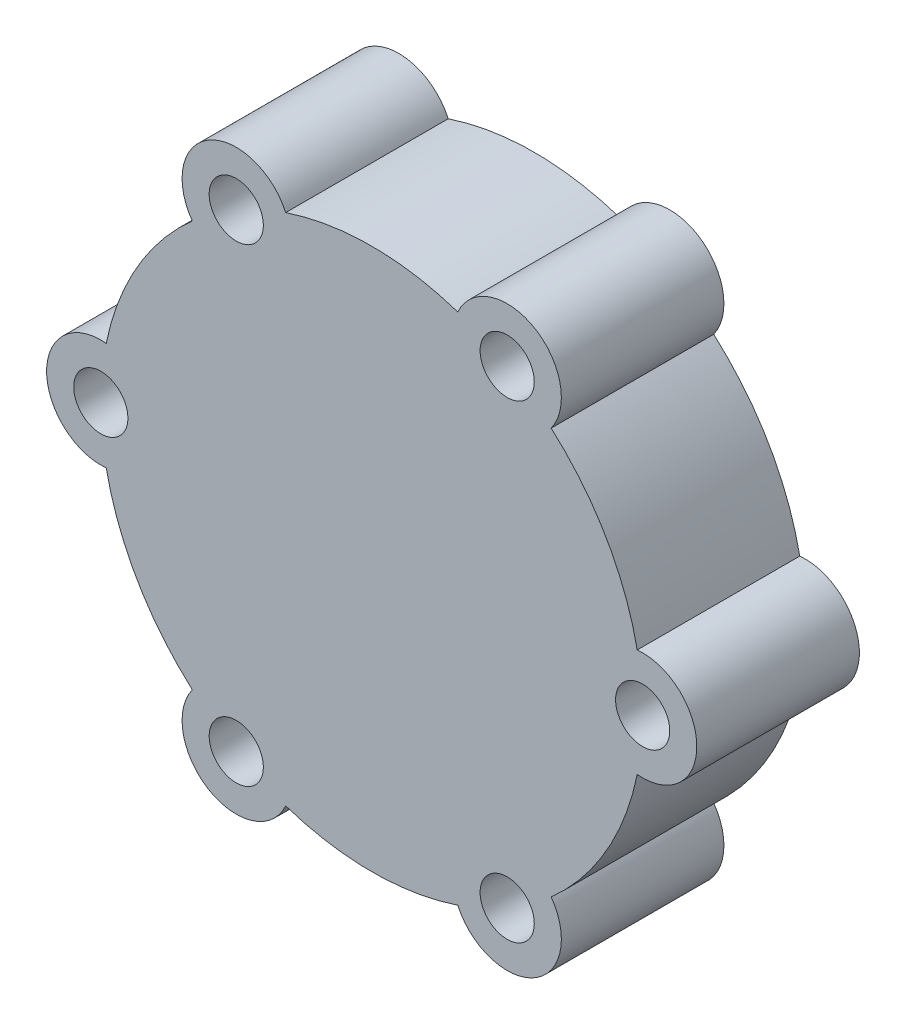
ISO-10303-21;
HEADER;
FILE_DESCRIPTION(('STEP AP214'),'2;1');
FILE_NAME('part.step','',(''),(''),'','','');
FILE_SCHEMA(('AUTOMOTIVE_DESIGN { 1 0 10303 214 1 1 1 1 }'));
ENDSEC;
DATA;
#1=APPLICATION_CONTEXT('core data for automotive mechanical design processes');
#2=APPLICATION_PROTOCOL_DEFINITION('international standard','automotive_design',2000,#1);
#3=PRODUCT_CONTEXT('',#1,'mechanical');
#4=PRODUCT('Part','Part','',(#3));
#5=PRODUCT_RELATED_PRODUCT_CATEGORY('part','',(#4));
#6=PRODUCT_DEFINITION_FORMATION('','',#4);
#7=PRODUCT_DEFINITION_CONTEXT('part definition',#1,'design');
#8=PRODUCT_DEFINITION('design','',#6,#7);
#9=PRODUCT_DEFINITION_SHAPE('','',#8);
#10=(LENGTH_UNIT() NAMED_UNIT(*) SI_UNIT(.MILLI.,.METRE.));
#11=(NAMED_UNIT(*) PLANE_ANGLE_UNIT() SI_UNIT($,.RADIAN.));
#12=(NAMED_UNIT(*) SI_UNIT($,.STERADIAN.) SOLID_ANGLE_UNIT());
#13=UNCERTAINTY_MEASURE_WITH_UNIT(LENGTH_MEASURE(1.E-05),#10,'distance_accuracy_value','');
#14=(GEOMETRIC_REPRESENTATION_CONTEXT(3) GLOBAL_UNCERTAINTY_ASSIGNED_CONTEXT((#13)) GLOBAL_UNIT_ASSIGNED_CONTEXT((#10,
#11,#12)) REPRESENTATION_CONTEXT('',''));
#15=CARTESIAN_POINT('',(0.,0.,0.));
#16=DIRECTION('',(0.,0.,1.));
#17=DIRECTION('',(1.,0.,0.));
#18=AXIS2_PLACEMENT_3D('',#15,#16,#17);
#19=CARTESIAN_POINT('',(25.,0.,30.));
#20=DIRECTION('',(0.,0.,1.));
#21=DIRECTION('',(1.,0.,0.));
#22=AXIS2_PLACEMENT_3D('',#19,#20,#21);
#23=PLANE('',#22);
#24=CARTESIAN_POINT('',(-24.9999999999996,43.3012701892222,30.));
#25=DIRECTION('',(0.,0.,1.));
#26=DIRECTION('',(1.,0.,0.));
#27=AXIS2_PLACEMENT_3D('',#24,#25,#26);
#28=CIRCLE('',#27,4.99999999999999);
#29=CARTESIAN_POINT('',(-19.9999999999996,43.3012701892222,30.));
#30=VERTEX_POINT('',#29);
#31=EDGE_CURVE('E303',#30,#30,#28,.T.);
#32=ORIENTED_EDGE('',*,*,#31,.F.);
#33=EDGE_LOOP('',(#32));
#34=FACE_BOUND('',#33,.T.);
#35=CARTESIAN_POINT('',(-25.0000000000002,-43.3012701892218,30.));
#36=DIRECTION('',(0.,0.,1.));
#37=DIRECTION('',(1.,0.,0.));
#38=AXIS2_PLACEMENT_3D('',#35,#36,#37);
#39=CIRCLE('',#38,5.);
#40=CARTESIAN_POINT('',(-20.0000000000002,-43.3012701892218,30.));
#41=VERTEX_POINT('',#40);
#42=EDGE_CURVE('E315',#41,#41,#39,.T.);
#43=ORIENTED_EDGE('',*,*,#42,.F.);
#44=EDGE_LOOP('',(#43));
#45=FACE_BOUND('',#44,.T.);
#46=CARTESIAN_POINT('',(50.,0.,30.));
#47=DIRECTION('',(0.,0.,1.));
#48=DIRECTION('',(1.,0.,0.));
#49=AXIS2_PLACEMENT_3D('',#46,#47,#48);
#50=CIRCLE('',#49,5.);
#51=CARTESIAN_POINT('',(55.,0.,30.));
#52=VERTEX_POINT('',#51);
#53=EDGE_CURVE('E162',#52,#52,#50,.T.);
#54=ORIENTED_EDGE('',*,*,#53,.F.);
#55=EDGE_LOOP('',(#54));
#56=FACE_BOUND('',#55,.T.);
#57=CARTESIAN_POINT('',(50.,0.,30.));
#58=DIRECTION('',(0.,0.,1.));
#59=DIRECTION('',(1.,0.,0.));
#60=AXIS2_PLACEMENT_3D('',#57,#58,#59);
#61=CIRCLE('',#60,10.);
#62=CARTESIAN_POINT('',(49.,-9.94987437106621,30.));
#63=VERTEX_POINT('',#62);
#64=CARTESIAN_POINT('',(49.,9.94987437106621,30.));
#65=VERTEX_POINT('',#64);
#66=EDGE_CURVE('E181',#63,#65,#61,.T.);
#67=ORIENTED_EDGE('',*,*,#66,.T.);
#68=CARTESIAN_POINT('',(0.,0.,30.));
#69=DIRECTION('',(0.,0.,1.));
#70=DIRECTION('',(1.,0.,0.));
#71=AXIS2_PLACEMENT_3D('',#68,#69,#70);
#72=CIRCLE('',#71,50.);
#73=CARTESIAN_POINT('',(33.1168439698075,37.460307599904,30.));
#74=VERTEX_POINT('',#73);
#75=EDGE_CURVE('E109',#65,#74,#72,.T.);
#76=ORIENTED_EDGE('',*,*,#75,.T.);
#77=CARTESIAN_POINT('',(25.0000000000005,43.3012701892216,30.));
#78=DIRECTION('',(0.,0.,1.));
#79=DIRECTION('',(1.,0.,0.));
#80=AXIS2_PLACEMENT_3D('',#77,#78,#79);
#81=CIRCLE('',#80,10.);
#82=CARTESIAN_POINT('',(15.8831560301935,47.4101819709704,30.));
#83=VERTEX_POINT('',#82);
#84=EDGE_CURVE('E208',#74,#83,#81,.T.);
#85=ORIENTED_EDGE('',*,*,#84,.T.);
#86=CARTESIAN_POINT('',(0.,0.,30.));
#87=DIRECTION('',(0.,0.,1.));
#88=DIRECTION('',(1.,0.,0.));
#89=AXIS2_PLACEMENT_3D('',#86,#87,#88);
#90=CIRCLE('',#89,50.);
#91=CARTESIAN_POINT('',(-15.8831560301925,47.4101819709708,30.));
#92=VERTEX_POINT('',#91);
#93=EDGE_CURVE('E227',#83,#92,#90,.T.);
#94=ORIENTED_EDGE('',*,*,#93,.T.);
#95=CARTESIAN_POINT('',(-24.9999999999996,43.3012701892222,30.));
#96=DIRECTION('',(0.,0.,1.));
#97=DIRECTION('',(1.,0.,0.));
#98=AXIS2_PLACEMENT_3D('',#95,#96,#97);
#99=CIRCLE('',#98,10.);
#100=CARTESIAN_POINT('',(-33.1168439698067,37.4603075999047,30.));
#101=VERTEX_POINT('',#100);
#102=EDGE_CURVE('E224',#92,#101,#99,.T.);
#103=ORIENTED_EDGE('',*,*,#102,.T.);
#104=CARTESIAN_POINT('',(0.,0.,30.));
#105=DIRECTION('',(0.,0.,1.));
#106=DIRECTION('',(1.,0.,0.));
#107=AXIS2_PLACEMENT_3D('',#104,#105,#106);
#108=CIRCLE('',#107,50.);
#109=CARTESIAN_POINT('',(-48.9999999999999,9.94987437106655,30.));
#110=VERTEX_POINT('',#109);
#111=EDGE_CURVE('E226',#101,#110,#108,.T.);
#112=ORIENTED_EDGE('',*,*,#111,.T.);
#113=CARTESIAN_POINT('',(-50.,3.49148133884313E-13,30.));
#114=DIRECTION('',(0.,0.,1.));
#115=DIRECTION('',(1.,0.,0.));
#116=AXIS2_PLACEMENT_3D('',#113,#114,#115);
#117=CIRCLE('',#116,10.);
#118=CARTESIAN_POINT('',(-49.0000000000001,-9.94987437106587,30.));
#119=VERTEX_POINT('',#118);
#120=EDGE_CURVE('E229',#110,#119,#117,.T.);
#121=ORIENTED_EDGE('',*,*,#120,.T.);
#122=CARTESIAN_POINT('',(0.,0.,30.));
#123=DIRECTION('',(0.,0.,1.));
#124=DIRECTION('',(1.,0.,0.));
#125=AXIS2_PLACEMENT_3D('',#122,#123,#124);
#126=CIRCLE('',#125,50.);
#127=CARTESIAN_POINT('',(-33.1168439698072,-37.4603075999042,30.));
#128=VERTEX_POINT('',#127);
#129=EDGE_CURVE('E235',#119,#128,#126,.T.);
#130=ORIENTED_EDGE('',*,*,#129,.T.);
#131=CARTESIAN_POINT('',(-25.0000000000002,-43.3012701892218,30.));
#132=DIRECTION('',(0.,0.,1.));
#133=DIRECTION('',(1.,0.,0.));
#134=AXIS2_PLACEMENT_3D('',#131,#132,#133);
#135=CIRCLE('',#134,10.);
#136=CARTESIAN_POINT('',(-15.8831560301932,-47.4101819709705,30.));
#137=VERTEX_POINT('',#136);
#138=EDGE_CURVE('E140',#128,#137,#135,.T.);
#139=ORIENTED_EDGE('',*,*,#138,.T.);
#140=CARTESIAN_POINT('',(0.,0.,30.));
#141=DIRECTION('',(0.,0.,1.));
#142=DIRECTION('',(1.,0.,0.));
#143=AXIS2_PLACEMENT_3D('',#140,#141,#142);
#144=CIRCLE('',#143,50.);
#145=CARTESIAN_POINT('',(15.8831560301928,-47.4101819709706,30.));
#146=VERTEX_POINT('',#145);
#147=EDGE_CURVE('E134',#137,#146,#144,.T.);
#148=ORIENTED_EDGE('',*,*,#147,.T.);
#149=CARTESIAN_POINT('',(24.9999999999999,-43.301270189222,30.));
#150=DIRECTION('',(0.,0.,1.));
#151=DIRECTION('',(1.,0.,0.));
#152=AXIS2_PLACEMENT_3D('',#149,#150,#151);
#153=CIRCLE('',#152,10.);
#154=CARTESIAN_POINT('',(33.116843969807,-37.4603075999045,30.));
#155=VERTEX_POINT('',#154);
#156=EDGE_CURVE('E138',#146,#155,#153,.T.);
#157=ORIENTED_EDGE('',*,*,#156,.T.);
#158=CARTESIAN_POINT('',(0.,0.,30.));
#159=DIRECTION('',(0.,0.,1.));
#160=DIRECTION('',(1.,0.,0.));
#161=AXIS2_PLACEMENT_3D('',#158,#159,#160);
#162=CIRCLE('',#161,50.);
#163=EDGE_CURVE('E54',#155,#63,#162,.T.);
#164=ORIENTED_EDGE('',*,*,#163,.T.);
#165=EDGE_LOOP('',(#67,#76,#85,#94,#103,#112,#121,#130,#139,#148,#157,#164));
#166=FACE_BOUND('',#165,.T.);
#167=CARTESIAN_POINT('',(24.9999999999999,-43.301270189222,30.));
#168=DIRECTION('',(0.,0.,1.));
#169=DIRECTION('',(1.,0.,0.));
#170=AXIS2_PLACEMENT_3D('',#167,#168,#169);
#171=CIRCLE('',#170,5.);
#172=CARTESIAN_POINT('',(29.9999999999999,-43.301270189222,30.));
#173=VERTEX_POINT('',#172);
#174=EDGE_CURVE('E321',#173,#173,#171,.T.);
#175=ORIENTED_EDGE('',*,*,#174,.F.);
#176=EDGE_LOOP('',(#175));
#177=FACE_BOUND('',#176,.T.);
#178=CARTESIAN_POINT('',(-50.,3.49148133884313E-13,30.));
#179=DIRECTION('',(0.,0.,1.));
#180=DIRECTION('',(1.,0.,0.));
#181=AXIS2_PLACEMENT_3D('',#178,#179,#180);
#182=CIRCLE('',#181,4.99999999999999);
#183=CARTESIAN_POINT('',(-45.,3.49148133884313E-13,30.));
#184=VERTEX_POINT('',#183);
#185=EDGE_CURVE('E309',#184,#184,#182,.T.);
#186=ORIENTED_EDGE('',*,*,#185,.F.);
#187=EDGE_LOOP('',(#186));
#188=FACE_BOUND('',#187,.T.);
#189=CARTESIAN_POINT('',(25.0000000000005,43.3012701892216,30.));
#190=DIRECTION('',(0.,0.,1.));
#191=DIRECTION('',(1.,0.,0.));
#192=AXIS2_PLACEMENT_3D('',#189,#190,#191);
#193=CIRCLE('',#192,5.);
#194=CARTESIAN_POINT('',(30.0000000000005,43.3012701892216,30.));
#195=VERTEX_POINT('',#194);
#196=EDGE_CURVE('E294',#195,#195,#193,.T.);
#197=ORIENTED_EDGE('',*,*,#196,.F.);
#198=EDGE_LOOP('',(#197));
#199=FACE_BOUND('',#198,.T.);
#200=ADVANCED_FACE('F37',(#34,#45,#56,#166,#177,#188,#199),#23,.T.);
#201=CARTESIAN_POINT('',(25.,0.,0.));
#202=DIRECTION('',(0.,0.,1.));
#203=DIRECTION('',(1.,0.,0.));
#204=AXIS2_PLACEMENT_3D('',#201,#202,#203);
#205=PLANE('',#204);
#206=CARTESIAN_POINT('',(50.,0.,0.));
#207=DIRECTION('',(0.,0.,1.));
#208=DIRECTION('',(1.,0.,0.));
#209=AXIS2_PLACEMENT_3D('',#206,#207,#208);
#210=CIRCLE('',#209,10.);
#211=CARTESIAN_POINT('',(49.,-9.94987437106621,0.));
#212=VERTEX_POINT('',#211);
#213=CARTESIAN_POINT('',(49.,9.94987437106621,0.));
#214=VERTEX_POINT('',#213);
#215=EDGE_CURVE('E158',#212,#214,#210,.T.);
#216=ORIENTED_EDGE('',*,*,#215,.F.);
#217=CARTESIAN_POINT('',(0.,0.,0.));
#218=DIRECTION('',(0.,0.,1.));
#219=DIRECTION('',(1.,0.,0.));
#220=AXIS2_PLACEMENT_3D('',#217,#218,#219);
#221=CIRCLE('',#220,50.);
#222=CARTESIAN_POINT('',(33.116843969807,-37.4603075999045,0.));
#223=VERTEX_POINT('',#222);
#224=EDGE_CURVE('E101',#223,#212,#221,.T.);
#225=ORIENTED_EDGE('',*,*,#224,.F.);
#226=CARTESIAN_POINT('',(24.9999999999999,-43.301270189222,0.));
#227=DIRECTION('',(0.,0.,1.));
#228=DIRECTION('',(1.,0.,0.));
#229=AXIS2_PLACEMENT_3D('',#226,#227,#228);
#230=CIRCLE('',#229,10.);
#231=CARTESIAN_POINT('',(15.8831560301928,-47.4101819709706,0.));
#232=VERTEX_POINT('',#231);
#233=EDGE_CURVE('E95',#232,#223,#230,.T.);
#234=ORIENTED_EDGE('',*,*,#233,.F.);
#235=CARTESIAN_POINT('',(0.,0.,0.));
#236=DIRECTION('',(0.,0.,1.));
#237=DIRECTION('',(1.,0.,0.));
#238=AXIS2_PLACEMENT_3D('',#235,#236,#237);
#239=CIRCLE('',#238,50.);
#240=CARTESIAN_POINT('',(-15.8831560301932,-47.4101819709705,0.));
#241=VERTEX_POINT('',#240);
#242=EDGE_CURVE('E148',#241,#232,#239,.T.);
#243=ORIENTED_EDGE('',*,*,#242,.F.);
#244=CARTESIAN_POINT('',(-25.0000000000002,-43.3012701892218,0.));
#245=DIRECTION('',(0.,0.,1.));
#246=DIRECTION('',(1.,0.,0.));
#247=AXIS2_PLACEMENT_3D('',#244,#245,#246);
#248=CIRCLE('',#247,10.);
#249=CARTESIAN_POINT('',(-33.1168439698072,-37.4603075999042,0.));
#250=VERTEX_POINT('',#249);
#251=EDGE_CURVE('E176',#250,#241,#248,.T.);
#252=ORIENTED_EDGE('',*,*,#251,.F.);
#253=CARTESIAN_POINT('',(0.,0.,0.));
#254=DIRECTION('',(0.,0.,1.));
#255=DIRECTION('',(1.,0.,0.));
#256=AXIS2_PLACEMENT_3D('',#253,#254,#255);
#257=CIRCLE('',#256,50.);
#258=CARTESIAN_POINT('',(-49.0000000000001,-9.94987437106587,0.));
#259=VERTEX_POINT('',#258);
#260=EDGE_CURVE('E174',#259,#250,#257,.T.);
#261=ORIENTED_EDGE('',*,*,#260,.F.);
#262=CARTESIAN_POINT('',(-50.,3.49148133884313E-13,0.));
#263=DIRECTION('',(0.,0.,1.));
#264=DIRECTION('',(1.,0.,0.));
#265=AXIS2_PLACEMENT_3D('',#262,#263,#264);
#266=CIRCLE('',#265,10.);
#267=CARTESIAN_POINT('',(-48.9999999999999,9.94987437106655,0.));
#268=VERTEX_POINT('',#267);
#269=EDGE_CURVE('E172',#268,#259,#266,.T.);
#270=ORIENTED_EDGE('',*,*,#269,.F.);
#271=CARTESIAN_POINT('',(0.,0.,0.));
#272=DIRECTION('',(0.,0.,1.));
#273=DIRECTION('',(1.,0.,0.));
#274=AXIS2_PLACEMENT_3D('',#271,#272,#273);
#275=CIRCLE('',#274,50.);
#276=CARTESIAN_POINT('',(-33.1168439698067,37.4603075999047,0.));
#277=VERTEX_POINT('',#276);
#278=EDGE_CURVE('E170',#277,#268,#275,.T.);
#279=ORIENTED_EDGE('',*,*,#278,.F.);
#280=CARTESIAN_POINT('',(-24.9999999999996,43.3012701892222,0.));
#281=DIRECTION('',(0.,0.,1.));
#282=DIRECTION('',(1.,0.,0.));
#283=AXIS2_PLACEMENT_3D('',#280,#281,#282);
#284=CIRCLE('',#283,10.);
#285=CARTESIAN_POINT('',(-15.8831560301925,47.4101819709708,0.));
#286=VERTEX_POINT('',#285);
#287=EDGE_CURVE('E168',#286,#277,#284,.T.);
#288=ORIENTED_EDGE('',*,*,#287,.F.);
#289=CARTESIAN_POINT('',(0.,0.,0.));
#290=DIRECTION('',(0.,0.,1.));
#291=DIRECTION('',(1.,0.,0.));
#292=AXIS2_PLACEMENT_3D('',#289,#290,#291);
#293=CIRCLE('',#292,50.);
#294=CARTESIAN_POINT('',(15.8831560301935,47.4101819709704,0.));
#295=VERTEX_POINT('',#294);
#296=EDGE_CURVE('E166',#295,#286,#293,.T.);
#297=ORIENTED_EDGE('',*,*,#296,.F.);
#298=CARTESIAN_POINT('',(25.0000000000005,43.3012701892216,0.));
#299=DIRECTION('',(0.,0.,1.));
#300=DIRECTION('',(1.,0.,0.));
#301=AXIS2_PLACEMENT_3D('',#298,#299,#300);
#302=CIRCLE('',#301,10.);
#303=CARTESIAN_POINT('',(33.1168439698075,37.460307599904,0.));
#304=VERTEX_POINT('',#303);
#305=EDGE_CURVE('E164',#304,#295,#302,.T.);
#306=ORIENTED_EDGE('',*,*,#305,.F.);
#307=CARTESIAN_POINT('',(0.,0.,0.));
#308=DIRECTION('',(0.,0.,1.));
#309=DIRECTION('',(1.,0.,0.));
#310=AXIS2_PLACEMENT_3D('',#307,#308,#309);
#311=CIRCLE('',#310,50.);
#312=EDGE_CURVE('E161',#214,#304,#311,.T.);
#313=ORIENTED_EDGE('',*,*,#312,.F.);
#314=EDGE_LOOP('',(#216,#225,#234,#243,#252,#261,#270,#279,#288,#297,#306,#313));
#315=FACE_BOUND('',#314,.T.);
#316=CARTESIAN_POINT('',(50.,0.,0.));
#317=DIRECTION('',(0.,0.,1.));
#318=DIRECTION('',(1.,0.,0.));
#319=AXIS2_PLACEMENT_3D('',#316,#317,#318);
#320=CIRCLE('',#319,5.);
#321=CARTESIAN_POINT('',(55.,0.,0.));
#322=VERTEX_POINT('',#321);
#323=EDGE_CURVE('E324',#322,#322,#320,.T.);
#324=ORIENTED_EDGE('',*,*,#323,.T.);
#325=EDGE_LOOP('',(#324));
#326=FACE_BOUND('',#325,.T.);
#327=CARTESIAN_POINT('',(24.9999999999999,-43.301270189222,0.));
#328=DIRECTION('',(0.,0.,1.));
#329=DIRECTION('',(1.,0.,0.));
#330=AXIS2_PLACEMENT_3D('',#327,#328,#329);
#331=CIRCLE('',#330,5.);
#332=CARTESIAN_POINT('',(29.9999999999999,-43.301270189222,0.));
#333=VERTEX_POINT('',#332);
#334=EDGE_CURVE('E318',#333,#333,#331,.T.);
#335=ORIENTED_EDGE('',*,*,#334,.T.);
#336=EDGE_LOOP('',(#335));
#337=FACE_BOUND('',#336,.T.);
#338=CARTESIAN_POINT('',(-25.0000000000002,-43.3012701892218,0.));
#339=DIRECTION('',(0.,0.,1.));
#340=DIRECTION('',(1.,0.,0.));
#341=AXIS2_PLACEMENT_3D('',#338,#339,#340);
#342=CIRCLE('',#341,5.);
#343=CARTESIAN_POINT('',(-20.0000000000002,-43.3012701892218,0.));
#344=VERTEX_POINT('',#343);
#345=EDGE_CURVE('E312',#344,#344,#342,.T.);
#346=ORIENTED_EDGE('',*,*,#345,.T.);
#347=EDGE_LOOP('',(#346));
#348=FACE_BOUND('',#347,.T.);
#349=CARTESIAN_POINT('',(-50.,3.49148133884313E-13,0.));
#350=DIRECTION('',(0.,0.,1.));
#351=DIRECTION('',(1.,0.,0.));
#352=AXIS2_PLACEMENT_3D('',#349,#350,#351);
#353=CIRCLE('',#352,4.99999999999999);
#354=CARTESIAN_POINT('',(-45.,3.49148133884313E-13,0.));
#355=VERTEX_POINT('',#354);
#356=EDGE_CURVE('E306',#355,#355,#353,.T.);
#357=ORIENTED_EDGE('',*,*,#356,.T.);
#358=EDGE_LOOP('',(#357));
#359=FACE_BOUND('',#358,.T.);
#360=CARTESIAN_POINT('',(-24.9999999999996,43.3012701892222,0.));
#361=DIRECTION('',(0.,0.,1.));
#362=DIRECTION('',(1.,0.,0.));
#363=AXIS2_PLACEMENT_3D('',#360,#361,#362);
#364=CIRCLE('',#363,4.99999999999999);
#365=CARTESIAN_POINT('',(-19.9999999999996,43.3012701892222,0.));
#366=VERTEX_POINT('',#365);
#367=EDGE_CURVE('E300',#366,#366,#364,.T.);
#368=ORIENTED_EDGE('',*,*,#367,.T.);
#369=EDGE_LOOP('',(#368));
#370=FACE_BOUND('',#369,.T.);
#371=CARTESIAN_POINT('',(25.0000000000005,43.3012701892216,0.));
#372=DIRECTION('',(0.,0.,1.));
#373=DIRECTION('',(1.,0.,0.));
#374=AXIS2_PLACEMENT_3D('',#371,#372,#373);
#375=CIRCLE('',#374,5.);
#376=CARTESIAN_POINT('',(30.0000000000005,43.3012701892216,0.));
#377=VERTEX_POINT('',#376);
#378=EDGE_CURVE('E297',#377,#377,#375,.T.);
#379=ORIENTED_EDGE('',*,*,#378,.T.);
#380=EDGE_LOOP('',(#379));
#381=FACE_BOUND('',#380,.T.);
#382=ADVANCED_FACE('F212',(#315,#326,#337,#348,#359,#370,#381),#205,.F.);
#383=CARTESIAN_POINT('',(50.,0.,30.));
#384=DIRECTION('',(0.,0.,-1.));
#385=DIRECTION('',(-1.,0.,0.));
#386=AXIS2_PLACEMENT_3D('',#383,#384,#385);
#387=CYLINDRICAL_SURFACE('',#386,10.);
#388=ORIENTED_EDGE('',*,*,#215,.T.);
#389=DIRECTION('',(0.,0.,-1.));
#390=VECTOR('',#389,1.);
#391=CARTESIAN_POINT('',(49.,9.94987437106621,30.));
#392=LINE('',#391,#390);
#393=EDGE_CURVE('E11',#65,#214,#392,.T.);
#394=ORIENTED_EDGE('',*,*,#393,.F.);
#395=ORIENTED_EDGE('',*,*,#66,.F.);
#396=DIRECTION('',(0.,0.,-1.));
#397=VECTOR('',#396,1.);
#398=CARTESIAN_POINT('',(49.,-9.94987437106621,30.));
#399=LINE('',#398,#397);
#400=EDGE_CURVE('E154',#63,#212,#399,.T.);
#401=ORIENTED_EDGE('',*,*,#400,.T.);
#402=EDGE_LOOP('',(#388,#394,#395,#401));
#403=FACE_BOUND('',#402,.T.);
#404=ADVANCED_FACE('F39',(#403),#387,.T.);
#405=CARTESIAN_POINT('',(0.,0.,30.));
#406=DIRECTION('',(0.,0.,-1.));
#407=DIRECTION('',(-1.,0.,0.));
#408=AXIS2_PLACEMENT_3D('',#405,#406,#407);
#409=CYLINDRICAL_SURFACE('',#408,50.);
#410=ORIENTED_EDGE('',*,*,#312,.T.);
#411=DIRECTION('',(0.,0.,-1.));
#412=VECTOR('',#411,1.);
#413=CARTESIAN_POINT('',(33.1168439698075,37.460307599904,30.));
#414=LINE('',#413,#412);
#415=EDGE_CURVE('E46',#74,#304,#414,.T.);
#416=ORIENTED_EDGE('',*,*,#415,.F.);
#417=ORIENTED_EDGE('',*,*,#75,.F.);
#418=ORIENTED_EDGE('',*,*,#393,.T.);
#419=EDGE_LOOP('',(#410,#416,#417,#418));
#420=FACE_BOUND('',#419,.T.);
#421=ADVANCED_FACE('F462',(#420),#409,.T.);
#422=CARTESIAN_POINT('',(25.0000000000005,43.3012701892216,30.));
#423=DIRECTION('',(0.,0.,-1.));
#424=DIRECTION('',(-1.,0.,0.));
#425=AXIS2_PLACEMENT_3D('',#422,#423,#424);
#426=CYLINDRICAL_SURFACE('',#425,10.);
#427=ORIENTED_EDGE('',*,*,#305,.T.);
#428=DIRECTION('',(0.,0.,-1.));
#429=VECTOR('',#428,1.);
#430=CARTESIAN_POINT('',(15.8831560301935,47.4101819709704,30.));
#431=LINE('',#430,#429);
#432=EDGE_CURVE('E200',#83,#295,#431,.T.);
#433=ORIENTED_EDGE('',*,*,#432,.F.);
#434=ORIENTED_EDGE('',*,*,#84,.F.);
#435=ORIENTED_EDGE('',*,*,#415,.T.);
#436=EDGE_LOOP('',(#427,#433,#434,#435));
#437=FACE_BOUND('',#436,.T.);
#438=ADVANCED_FACE('F206',(#437),#426,.T.);
#439=CARTESIAN_POINT('',(0.,0.,30.));
#440=DIRECTION('',(0.,0.,-1.));
#441=DIRECTION('',(-1.,0.,0.));
#442=AXIS2_PLACEMENT_3D('',#439,#440,#441);
#443=CYLINDRICAL_SURFACE('',#442,50.);
#444=ORIENTED_EDGE('',*,*,#296,.T.);
#445=DIRECTION('',(0.,0.,-1.));
#446=VECTOR('',#445,1.);
#447=CARTESIAN_POINT('',(-15.8831560301925,47.4101819709708,30.));
#448=LINE('',#447,#446);
#449=EDGE_CURVE('E197',#92,#286,#448,.T.);
#450=ORIENTED_EDGE('',*,*,#449,.F.);
#451=ORIENTED_EDGE('',*,*,#93,.F.);
#452=ORIENTED_EDGE('',*,*,#432,.T.);
#453=EDGE_LOOP('',(#444,#450,#451,#452));
#454=FACE_BOUND('',#453,.T.);
#455=ADVANCED_FACE('F218',(#454),#443,.T.);
#456=CARTESIAN_POINT('',(-24.9999999999996,43.3012701892222,30.));
#457=DIRECTION('',(0.,0.,-1.));
#458=DIRECTION('',(-1.,0.,0.));
#459=AXIS2_PLACEMENT_3D('',#456,#457,#458);
#460=CYLINDRICAL_SURFACE('',#459,10.);
#461=ORIENTED_EDGE('',*,*,#287,.T.);
#462=DIRECTION('',(0.,0.,-1.));
#463=VECTOR('',#462,1.);
#464=CARTESIAN_POINT('',(-33.1168439698067,37.4603075999047,30.));
#465=LINE('',#464,#463);
#466=EDGE_CURVE('E194',#101,#277,#465,.T.);
#467=ORIENTED_EDGE('',*,*,#466,.F.);
#468=ORIENTED_EDGE('',*,*,#102,.F.);
#469=ORIENTED_EDGE('',*,*,#449,.T.);
#470=EDGE_LOOP('',(#461,#467,#468,#469));
#471=FACE_BOUND('',#470,.T.);
#472=ADVANCED_FACE('F222',(#471),#460,.T.);
#473=CARTESIAN_POINT('',(0.,0.,30.));
#474=DIRECTION('',(0.,0.,-1.));
#475=DIRECTION('',(-1.,0.,0.));
#476=AXIS2_PLACEMENT_3D('',#473,#474,#475);
#477=CYLINDRICAL_SURFACE('',#476,50.);
#478=ORIENTED_EDGE('',*,*,#278,.T.);
#479=DIRECTION('',(0.,0.,-1.));
#480=VECTOR('',#479,1.);
#481=CARTESIAN_POINT('',(-48.9999999999999,9.94987437106655,30.));
#482=LINE('',#481,#480);
#483=EDGE_CURVE('E191',#110,#268,#482,.T.);
#484=ORIENTED_EDGE('',*,*,#483,.F.);
#485=ORIENTED_EDGE('',*,*,#111,.F.);
#486=ORIENTED_EDGE('',*,*,#466,.T.);
#487=EDGE_LOOP('',(#478,#484,#485,#486));
#488=FACE_BOUND('',#487,.T.);
#489=ADVANCED_FACE('F423',(#488),#477,.T.);
#490=CARTESIAN_POINT('',(-50.,3.49148133884313E-13,30.));
#491=DIRECTION('',(0.,0.,-1.));
#492=DIRECTION('',(-1.,0.,0.));
#493=AXIS2_PLACEMENT_3D('',#490,#491,#492);
#494=CYLINDRICAL_SURFACE('',#493,10.);
#495=ORIENTED_EDGE('',*,*,#269,.T.);
#496=DIRECTION('',(0.,0.,-1.));
#497=VECTOR('',#496,1.);
#498=CARTESIAN_POINT('',(-49.0000000000001,-9.94987437106587,30.));
#499=LINE('',#498,#497);
#500=EDGE_CURVE('E188',#119,#259,#499,.T.);
#501=ORIENTED_EDGE('',*,*,#500,.F.);
#502=ORIENTED_EDGE('',*,*,#120,.F.);
#503=ORIENTED_EDGE('',*,*,#483,.T.);
#504=EDGE_LOOP('',(#495,#501,#502,#503));
#505=FACE_BOUND('',#504,.T.);
#506=ADVANCED_FACE('F413',(#505),#494,.T.);
#507=CARTESIAN_POINT('',(0.,0.,30.));
#508=DIRECTION('',(0.,0.,-1.));
#509=DIRECTION('',(-1.,0.,0.));
#510=AXIS2_PLACEMENT_3D('',#507,#508,#509);
#511=CYLINDRICAL_SURFACE('',#510,50.);
#512=ORIENTED_EDGE('',*,*,#260,.T.);
#513=DIRECTION('',(0.,0.,-1.));
#514=VECTOR('',#513,1.);
#515=CARTESIAN_POINT('',(-33.1168439698072,-37.4603075999042,30.));
#516=LINE('',#515,#514);
#517=EDGE_CURVE('E185',#128,#250,#516,.T.);
#518=ORIENTED_EDGE('',*,*,#517,.F.);
#519=ORIENTED_EDGE('',*,*,#129,.F.);
#520=ORIENTED_EDGE('',*,*,#500,.T.);
#521=EDGE_LOOP('',(#512,#518,#519,#520));
#522=FACE_BOUND('',#521,.T.);
#523=ADVANCED_FACE('F241',(#522),#511,.T.);
#524=CARTESIAN_POINT('',(-25.0000000000002,-43.3012701892218,30.));
#525=DIRECTION('',(0.,0.,-1.));
#526=DIRECTION('',(-1.,0.,0.));
#527=AXIS2_PLACEMENT_3D('',#524,#525,#526);
#528=CYLINDRICAL_SURFACE('',#527,10.);
#529=ORIENTED_EDGE('',*,*,#251,.T.);
#530=DIRECTION('',(0.,0.,-1.));
#531=VECTOR('',#530,1.);
#532=CARTESIAN_POINT('',(-15.8831560301932,-47.4101819709705,30.));
#533=LINE('',#532,#531);
#534=EDGE_CURVE('E149',#137,#241,#533,.T.);
#535=ORIENTED_EDGE('',*,*,#534,.F.);
#536=ORIENTED_EDGE('',*,*,#138,.F.);
#537=ORIENTED_EDGE('',*,*,#517,.T.);
#538=EDGE_LOOP('',(#529,#535,#536,#537));
#539=FACE_BOUND('',#538,.T.);
#540=ADVANCED_FACE('F245',(#539),#528,.T.);
#541=CARTESIAN_POINT('',(0.,0.,30.));
#542=DIRECTION('',(0.,0.,-1.));
#543=DIRECTION('',(-1.,0.,0.));
#544=AXIS2_PLACEMENT_3D('',#541,#542,#543);
#545=CYLINDRICAL_SURFACE('',#544,50.);
#546=ORIENTED_EDGE('',*,*,#242,.T.);
#547=DIRECTION('',(0.,0.,-1.));
#548=VECTOR('',#547,1.);
#549=CARTESIAN_POINT('',(15.8831560301928,-47.4101819709706,30.));
#550=LINE('',#549,#548);
#551=EDGE_CURVE('E145',#146,#232,#550,.T.);
#552=ORIENTED_EDGE('',*,*,#551,.F.);
#553=ORIENTED_EDGE('',*,*,#147,.F.);
#554=ORIENTED_EDGE('',*,*,#534,.T.);
#555=EDGE_LOOP('',(#546,#552,#553,#554));
#556=FACE_BOUND('',#555,.T.);
#557=ADVANCED_FACE('F146',(#556),#545,.T.);
#558=CARTESIAN_POINT('',(24.9999999999999,-43.301270189222,30.));
#559=DIRECTION('',(0.,0.,-1.));
#560=DIRECTION('',(-1.,0.,0.));
#561=AXIS2_PLACEMENT_3D('',#558,#559,#560);
#562=CYLINDRICAL_SURFACE('',#561,10.);
#563=ORIENTED_EDGE('',*,*,#233,.T.);
#564=DIRECTION('',(0.,0.,-1.));
#565=VECTOR('',#564,1.);
#566=CARTESIAN_POINT('',(33.116843969807,-37.4603075999045,30.));
#567=LINE('',#566,#565);
#568=EDGE_CURVE('E150',#155,#223,#567,.T.);
#569=ORIENTED_EDGE('',*,*,#568,.F.);
#570=ORIENTED_EDGE('',*,*,#156,.F.);
#571=ORIENTED_EDGE('',*,*,#551,.T.);
#572=EDGE_LOOP('',(#563,#569,#570,#571));
#573=FACE_BOUND('',#572,.T.);
#574=ADVANCED_FACE('F152',(#573),#562,.T.);
#575=CARTESIAN_POINT('',(0.,0.,30.));
#576=DIRECTION('',(0.,0.,-1.));
#577=DIRECTION('',(-1.,0.,0.));
#578=AXIS2_PLACEMENT_3D('',#575,#576,#577);
#579=CYLINDRICAL_SURFACE('',#578,50.);
#580=ORIENTED_EDGE('',*,*,#224,.T.);
#581=ORIENTED_EDGE('',*,*,#400,.F.);
#582=ORIENTED_EDGE('',*,*,#163,.F.);
#583=ORIENTED_EDGE('',*,*,#568,.T.);
#584=EDGE_LOOP('',(#580,#581,#582,#583));
#585=FACE_BOUND('',#584,.T.);
#586=ADVANCED_FACE('F249',(#585),#579,.T.);
#587=CARTESIAN_POINT('',(50.,0.,30.));
#588=DIRECTION('',(0.,0.,-1.));
#589=DIRECTION('',(-1.,0.,0.));
#590=AXIS2_PLACEMENT_3D('',#587,#588,#589);
#591=CYLINDRICAL_SURFACE('',#590,5.);
#592=ORIENTED_EDGE('',*,*,#53,.T.);
#593=EDGE_LOOP('',(#592));
#594=FACE_BOUND('',#593,.T.);
#595=ORIENTED_EDGE('',*,*,#323,.F.);
#596=EDGE_LOOP('',(#595));
#597=FACE_BOUND('',#596,.T.);
#598=ADVANCED_FACE('F251',(#594,#597),#591,.F.);
#599=CARTESIAN_POINT('',(24.9999999999999,-43.301270189222,30.));
#600=DIRECTION('',(0.,0.,-1.));
#601=DIRECTION('',(-1.,0.,0.));
#602=AXIS2_PLACEMENT_3D('',#599,#600,#601);
#603=CYLINDRICAL_SURFACE('',#602,5.);
#604=ORIENTED_EDGE('',*,*,#174,.T.);
#605=EDGE_LOOP('',(#604));
#606=FACE_BOUND('',#605,.T.);
#607=ORIENTED_EDGE('',*,*,#334,.F.);
#608=EDGE_LOOP('',(#607));
#609=FACE_BOUND('',#608,.T.);
#610=ADVANCED_FACE('F257',(#606,#609),#603,.F.);
#611=CARTESIAN_POINT('',(-25.0000000000002,-43.3012701892218,30.));
#612=DIRECTION('',(0.,0.,-1.));
#613=DIRECTION('',(-1.,0.,0.));
#614=AXIS2_PLACEMENT_3D('',#611,#612,#613);
#615=CYLINDRICAL_SURFACE('',#614,5.);
#616=ORIENTED_EDGE('',*,*,#42,.T.);
#617=EDGE_LOOP('',(#616));
#618=FACE_BOUND('',#617,.T.);
#619=ORIENTED_EDGE('',*,*,#345,.F.);
#620=EDGE_LOOP('',(#619));
#621=FACE_BOUND('',#620,.T.);
#622=ADVANCED_FACE('F273',(#618,#621),#615,.F.);
#623=CARTESIAN_POINT('',(-50.,3.49148133884313E-13,30.));
#624=DIRECTION('',(0.,0.,-1.));
#625=DIRECTION('',(-1.,0.,0.));
#626=AXIS2_PLACEMENT_3D('',#623,#624,#625);
#627=CYLINDRICAL_SURFACE('',#626,4.99999999999999);
#628=ORIENTED_EDGE('',*,*,#185,.T.);
#629=EDGE_LOOP('',(#628));
#630=FACE_BOUND('',#629,.T.);
#631=ORIENTED_EDGE('',*,*,#356,.F.);
#632=EDGE_LOOP('',(#631));
#633=FACE_BOUND('',#632,.T.);
#634=ADVANCED_FACE('F277',(#630,#633),#627,.F.);
#635=CARTESIAN_POINT('',(-24.9999999999996,43.3012701892222,30.));
#636=DIRECTION('',(0.,0.,-1.));
#637=DIRECTION('',(-1.,0.,0.));
#638=AXIS2_PLACEMENT_3D('',#635,#636,#637);
#639=CYLINDRICAL_SURFACE('',#638,4.99999999999999);
#640=ORIENTED_EDGE('',*,*,#31,.T.);
#641=EDGE_LOOP('',(#640));
#642=FACE_BOUND('',#641,.T.);
#643=ORIENTED_EDGE('',*,*,#367,.F.);
#644=EDGE_LOOP('',(#643));
#645=FACE_BOUND('',#644,.T.);
#646=ADVANCED_FACE('F281',(#642,#645),#639,.F.);
#647=CARTESIAN_POINT('',(25.0000000000005,43.3012701892216,30.));
#648=DIRECTION('',(0.,0.,-1.));
#649=DIRECTION('',(-1.,0.,0.));
#650=AXIS2_PLACEMENT_3D('',#647,#648,#649);
#651=CYLINDRICAL_SURFACE('',#650,5.);
#652=ORIENTED_EDGE('',*,*,#196,.T.);
#653=EDGE_LOOP('',(#652));
#654=FACE_BOUND('',#653,.T.);
#655=ORIENTED_EDGE('',*,*,#378,.F.);
#656=EDGE_LOOP('',(#655));
#657=FACE_BOUND('',#656,.T.);
#658=ADVANCED_FACE('F285',(#654,#657),#651,.F.);
#659=CLOSED_SHELL('',(#200,#382,#404,#421,#438,#455,#472,#489,#506,#523,#540,#557,#574,#586,
#598,#610,#622,#634,#646,#658));
#660=MANIFOLD_SOLID_BREP('B2',#659);
#661=ADVANCED_BREP_SHAPE_REPRESENTATION('',(#18,#660),#14);
#662=SHAPE_DEFINITION_REPRESENTATION(#9,#661);
ENDSEC;
END-ISO-10303-21;
